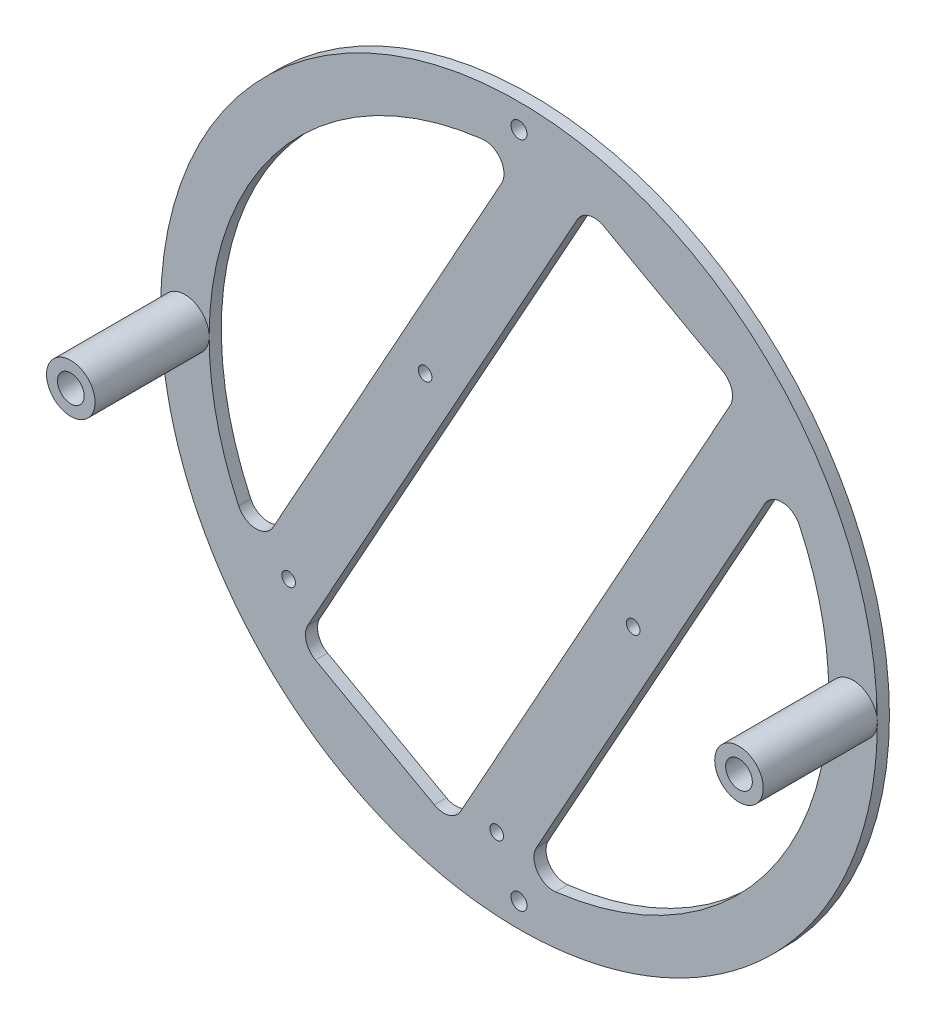
ISO-10303-21;
HEADER;
FILE_DESCRIPTION(('STEP AP214'),'2;1');
FILE_NAME('part.step','',(''),(''),'','','');
FILE_SCHEMA(('AUTOMOTIVE_DESIGN { 1 0 10303 214 1 1 1 1 }'));
ENDSEC;
DATA;
#1=APPLICATION_CONTEXT('core data for automotive mechanical design processes');
#2=APPLICATION_PROTOCOL_DEFINITION('international standard','automotive_design',2000,#1);
#3=PRODUCT_CONTEXT('',#1,'mechanical');
#4=PRODUCT('Part','Part','',(#3));
#5=PRODUCT_RELATED_PRODUCT_CATEGORY('part','',(#4));
#6=PRODUCT_DEFINITION_FORMATION('','',#4);
#7=PRODUCT_DEFINITION_CONTEXT('part definition',#1,'design');
#8=PRODUCT_DEFINITION('design','',#6,#7);
#9=PRODUCT_DEFINITION_SHAPE('','',#8);
#10=(LENGTH_UNIT() NAMED_UNIT(*) SI_UNIT(.MILLI.,.METRE.));
#11=(NAMED_UNIT(*) PLANE_ANGLE_UNIT() SI_UNIT($,.RADIAN.));
#12=(NAMED_UNIT(*) SI_UNIT($,.STERADIAN.) SOLID_ANGLE_UNIT());
#13=UNCERTAINTY_MEASURE_WITH_UNIT(LENGTH_MEASURE(1.E-05),#10,'distance_accuracy_value','');
#14=(GEOMETRIC_REPRESENTATION_CONTEXT(3) GLOBAL_UNCERTAINTY_ASSIGNED_CONTEXT((#13)) GLOBAL_UNIT_ASSIGNED_CONTEXT((#10,
#11,#12)) REPRESENTATION_CONTEXT('',''));
#15=CARTESIAN_POINT('',(0.,0.,0.));
#16=DIRECTION('',(0.,0.,1.));
#17=DIRECTION('',(1.,0.,0.));
#18=AXIS2_PLACEMENT_3D('',#15,#16,#17);
#19=CARTESIAN_POINT('',(0.,0.,2.5));
#20=DIRECTION('',(0.,0.,1.));
#21=DIRECTION('',(1.,0.,0.));
#22=AXIS2_PLACEMENT_3D('',#19,#20,#21);
#23=PLANE('',#22);
#24=CARTESIAN_POINT('',(68.825,0.,2.5));
#25=DIRECTION('',(0.,0.,1.));
#26=DIRECTION('',(1.,0.,0.));
#27=AXIS2_PLACEMENT_3D('',#24,#25,#26);
#28=CIRCLE('',#27,1.65);
#29=CARTESIAN_POINT('',(70.475,0.,2.5));
#30=VERTEX_POINT('',#29);
#31=EDGE_CURVE('E216',#30,#30,#28,.T.);
#32=ORIENTED_EDGE('',*,*,#31,.F.);
#33=EDGE_LOOP('',(#32));
#34=FACE_BOUND('',#33,.T.);
#35=CARTESIAN_POINT('',(68.825,0.,2.5));
#36=DIRECTION('',(0.,0.,1.));
#37=DIRECTION('',(1.,0.,0.));
#38=AXIS2_PLACEMENT_3D('',#35,#36,#37);
#39=CIRCLE('',#38,2.75000000000001);
#40=CARTESIAN_POINT('',(71.575,0.,2.5));
#41=VERTEX_POINT('',#40);
#42=EDGE_CURVE('E50',#41,#41,#39,.F.);
#43=ORIENTED_EDGE('',*,*,#42,.F.);
#44=EDGE_LOOP('',(#43));
#45=FACE_BOUND('',#44,.T.);
#46=ADVANCED_FACE('F42',(#34,#45),#23,.T.);
#47=CARTESIAN_POINT('',(-68.825,0.,2.5));
#48=DIRECTION('',(0.,0.,1.));
#49=DIRECTION('',(1.,0.,0.));
#50=AXIS2_PLACEMENT_3D('',#47,#48,#49);
#51=CIRCLE('',#50,1.65);
#52=CARTESIAN_POINT('',(-67.175,0.,2.5));
#53=VERTEX_POINT('',#52);
#54=EDGE_CURVE('E210',#53,#53,#51,.T.);
#55=ORIENTED_EDGE('',*,*,#54,.F.);
#56=EDGE_LOOP('',(#55));
#57=FACE_BOUND('',#56,.T.);
#58=CARTESIAN_POINT('',(-68.825,0.,2.5));
#59=DIRECTION('',(0.,0.,1.));
#60=DIRECTION('',(1.,0.,0.));
#61=AXIS2_PLACEMENT_3D('',#58,#59,#60);
#62=CIRCLE('',#61,2.75000000000001);
#63=CARTESIAN_POINT('',(-66.075,0.,2.5));
#64=VERTEX_POINT('',#63);
#65=EDGE_CURVE('E371',#64,#64,#62,.T.);
#66=ORIENTED_EDGE('',*,*,#65,.T.);
#67=EDGE_LOOP('',(#66));
#68=FACE_BOUND('',#67,.T.);
#69=ADVANCED_FACE('F398',(#57,#68),#23,.T.);
#70=CARTESIAN_POINT('',(-27.1132109213214,15.0290982276363,2.5));
#71=DIRECTION('',(0.874619707139399,-0.484809620246332,0.));
#72=DIRECTION('',(0.484809620246332,0.874619707139399,0.));
#73=AXIS2_PLACEMENT_3D('',#70,#71,#72);
#74=PLANE('',#73);
#75=DIRECTION('',(-0.484809620246332,-0.874619707139399,0.));
#76=VECTOR('',#75,1.);
#77=CARTESIAN_POINT('',(-27.1132109213214,15.0290982276363,0.));
#78=LINE('',#77,#76);
#79=CARTESIAN_POINT('',(-3.59104639275873,57.4642063445155,0.));
#80=VERTEX_POINT('',#79);
#81=CARTESIAN_POINT('',(-50.635375449884,-27.4060098892429,0.));
#82=VERTEX_POINT('',#81);
#83=EDGE_CURVE('E288',#80,#82,#78,.T.);
#84=ORIENTED_EDGE('',*,*,#83,.T.);
#85=DIRECTION('',(0.,0.,1.));
#86=VECTOR('',#85,1.);
#87=CARTESIAN_POINT('',(-50.635375449884,-27.4060098892429,2.5));
#88=LINE('',#87,#86);
#89=CARTESIAN_POINT('',(-50.635375449884,-27.4060098892429,2.5));
#90=VERTEX_POINT('',#89);
#91=EDGE_CURVE('E329',#82,#90,#88,.T.);
#92=ORIENTED_EDGE('',*,*,#91,.T.);
#93=DIRECTION('',(-0.484809620246332,-0.874619707139399,0.));
#94=VECTOR('',#93,1.);
#95=CARTESIAN_POINT('',(-27.1132109213214,15.0290982276363,2.5));
#96=LINE('',#95,#94);
#97=CARTESIAN_POINT('',(-3.59104639275873,57.4642063445155,2.5));
#98=VERTEX_POINT('',#97);
#99=EDGE_CURVE('E235',#98,#90,#96,.T.);
#100=ORIENTED_EDGE('',*,*,#99,.F.);
#101=DIRECTION('',(0.,0.,1.));
#102=VECTOR('',#101,1.);
#103=CARTESIAN_POINT('',(-3.59104639275873,57.4642063445155,0.));
#104=LINE('',#103,#102);
#105=EDGE_CURVE('E326',#98,#80,#104,.F.);
#106=ORIENTED_EDGE('',*,*,#105,.T.);
#107=EDGE_LOOP('',(#84,#92,#100,#106));
#108=FACE_BOUND('',#107,.T.);
#109=ADVANCED_FACE('F404',(#108),#74,.F.);
#110=CARTESIAN_POINT('',(-15.7431547285092,8.72657316443398,2.5));
#111=DIRECTION('',(-0.874619707139399,0.484809620246332,0.));
#112=DIRECTION('',(-0.484809620246332,-0.874619707139399,0.));
#113=AXIS2_PLACEMENT_3D('',#110,#111,#112);
#114=PLANE('',#113);
#115=DIRECTION('',(0.484809620246332,0.874619707139399,0.));
#116=VECTOR('',#115,1.);
#117=CARTESIAN_POINT('',(-15.7431547285092,8.72657316443398,2.5));
#118=LINE('',#117,#116);
#119=CARTESIAN_POINT('',(-43.4908588574801,-41.3316101833723,2.5));
#120=VERTEX_POINT('',#119);
#121=CARTESIAN_POINT('',(12.0045494004617,58.7847565122402,2.5));
#122=VERTEX_POINT('',#121);
#123=EDGE_CURVE('E222',#120,#122,#118,.T.);
#124=ORIENTED_EDGE('',*,*,#123,.F.);
#125=DIRECTION('',(0.,0.,-1.));
#126=VECTOR('',#125,1.);
#127=CARTESIAN_POINT('',(-43.4908588574801,-41.3316101833723,2.5));
#128=LINE('',#127,#126);
#129=CARTESIAN_POINT('',(-43.4908588574801,-41.3316101833723,0.));
#130=VERTEX_POINT('',#129);
#131=EDGE_CURVE('E304',#120,#130,#128,.T.);
#132=ORIENTED_EDGE('',*,*,#131,.T.);
#133=DIRECTION('',(0.484809620246332,0.874619707139399,0.));
#134=VECTOR('',#133,1.);
#135=CARTESIAN_POINT('',(-15.7431547285092,8.72657316443398,0.));
#136=LINE('',#135,#134);
#137=CARTESIAN_POINT('',(12.0045494004617,58.7847565122402,0.));
#138=VERTEX_POINT('',#137);
#139=EDGE_CURVE('E273',#130,#138,#136,.T.);
#140=ORIENTED_EDGE('',*,*,#139,.T.);
#141=DIRECTION('',(0.,0.,-1.));
#142=VECTOR('',#141,1.);
#143=CARTESIAN_POINT('',(12.0045494004617,58.7847565122402,2.5));
#144=LINE('',#143,#142);
#145=EDGE_CURVE('E302',#138,#122,#144,.F.);
#146=ORIENTED_EDGE('',*,*,#145,.T.);
#147=EDGE_LOOP('',(#124,#132,#140,#146));
#148=FACE_BOUND('',#147,.T.);
#149=ADVANCED_FACE('F432',(#148),#114,.F.);
#150=CARTESIAN_POINT('',(29.6869426099562,53.5566621763639,2.5));
#151=DIRECTION('',(0.484809620246331,0.874619707139399,0.));
#152=DIRECTION('',(-0.874619707139399,0.484809620246331,0.));
#153=AXIS2_PLACEMENT_3D('',#150,#151,#152);
#154=PLANE('',#153);
#155=DIRECTION('',(0.874619707139399,-0.484809620246331,0.));
#156=VECTOR('',#155,1.);
#157=CARTESIAN_POINT('',(29.6869426099562,53.5566621763639,0.));
#158=LINE('',#157,#156);
#159=CARTESIAN_POINT('',(17.4422667100046,60.3439968598125,0.));
#160=VERTEX_POINT('',#159);
#161=CARTESIAN_POINT('',(41.9316185099078,46.7693274929152,0.));
#162=VERTEX_POINT('',#161);
#163=EDGE_CURVE('E276',#160,#162,#158,.T.);
#164=ORIENTED_EDGE('',*,*,#163,.T.);
#165=DIRECTION('',(0.,0.,-1.));
#166=VECTOR('',#165,1.);
#167=CARTESIAN_POINT('',(41.9316185099078,46.7693274929152,2.5));
#168=LINE('',#167,#166);
#169=CARTESIAN_POINT('',(41.9316185099078,46.7693274929152,2.5));
#170=VERTEX_POINT('',#169);
#171=EDGE_CURVE('E310',#162,#170,#168,.F.);
#172=ORIENTED_EDGE('',*,*,#171,.T.);
#173=DIRECTION('',(0.874619707139399,-0.484809620246331,0.));
#174=VECTOR('',#173,1.);
#175=CARTESIAN_POINT('',(29.6869426099562,53.5566621763639,2.5));
#176=LINE('',#175,#174);
#177=CARTESIAN_POINT('',(17.4422667100046,60.3439968598125,2.5));
#178=VERTEX_POINT('',#177);
#179=EDGE_CURVE('E225',#178,#170,#176,.T.);
#180=ORIENTED_EDGE('',*,*,#179,.F.);
#181=DIRECTION('',(0.,0.,-1.));
#182=VECTOR('',#181,1.);
#183=CARTESIAN_POINT('',(17.4422667100046,60.3439968598125,0.));
#184=LINE('',#183,#182);
#185=EDGE_CURVE('E307',#178,#160,#184,.T.);
#186=ORIENTED_EDGE('',*,*,#185,.T.);
#187=EDGE_LOOP('',(#164,#172,#180,#186));
#188=FACE_BOUND('',#187,.T.);
#189=ADVANCED_FACE('F446',(#188),#154,.F.);
#190=CARTESIAN_POINT('',(15.7431547285092,-8.72657316443397,2.5));
#191=DIRECTION('',(0.874619707139399,-0.484809620246332,0.));
#192=DIRECTION('',(0.484809620246332,0.874619707139399,0.));
#193=AXIS2_PLACEMENT_3D('',#190,#191,#192);
#194=PLANE('',#193);
#195=DIRECTION('',(-0.484809620246332,-0.874619707139399,0.));
#196=VECTOR('',#195,1.);
#197=CARTESIAN_POINT('',(15.7431547285092,-8.72657316443397,0.));
#198=LINE('',#197,#196);
#199=CARTESIAN_POINT('',(43.4908588574801,41.3316101833723,0.));
#200=VERTEX_POINT('',#199);
#201=CARTESIAN_POINT('',(-12.0045494004617,-58.7847565122403,0.));
#202=VERTEX_POINT('',#201);
#203=EDGE_CURVE('E279',#200,#202,#198,.T.);
#204=ORIENTED_EDGE('',*,*,#203,.T.);
#205=DIRECTION('',(0.,0.,-1.));
#206=VECTOR('',#205,1.);
#207=CARTESIAN_POINT('',(-12.0045494004617,-58.7847565122403,2.5));
#208=LINE('',#207,#206);
#209=CARTESIAN_POINT('',(-12.0045494004617,-58.7847565122403,2.5));
#210=VERTEX_POINT('',#209);
#211=EDGE_CURVE('E300',#202,#210,#208,.F.);
#212=ORIENTED_EDGE('',*,*,#211,.T.);
#213=DIRECTION('',(-0.484809620246332,-0.874619707139399,0.));
#214=VECTOR('',#213,1.);
#215=CARTESIAN_POINT('',(15.7431547285092,-8.72657316443397,2.5));
#216=LINE('',#215,#214);
#217=CARTESIAN_POINT('',(43.4908588574801,41.3316101833723,2.5));
#218=VERTEX_POINT('',#217);
#219=EDGE_CURVE('E228',#218,#210,#216,.T.);
#220=ORIENTED_EDGE('',*,*,#219,.F.);
#221=DIRECTION('',(0.,0.,-1.));
#222=VECTOR('',#221,1.);
#223=CARTESIAN_POINT('',(43.4908588574801,41.3316101833723,0.));
#224=LINE('',#223,#222);
#225=EDGE_CURVE('E297',#218,#200,#224,.T.);
#226=ORIENTED_EDGE('',*,*,#225,.T.);
#227=EDGE_LOOP('',(#204,#212,#220,#226));
#228=FACE_BOUND('',#227,.T.);
#229=ADVANCED_FACE('F443',(#228),#194,.F.);
#230=CARTESIAN_POINT('',(0.,0.,2.5));
#231=DIRECTION('',(0.,0.,-1.));
#232=DIRECTION('',(-1.,0.,0.));
#233=AXIS2_PLACEMENT_3D('',#230,#231,#232);
#234=CYLINDRICAL_SURFACE('',#233,63.825);
#235=CARTESIAN_POINT('',(0.,0.,0.));
#236=DIRECTION('',(0.,0.,1.));
#237=DIRECTION('',(1.,0.,0.));
#238=AXIS2_PLACEMENT_3D('',#235,#236,#237);
#239=CIRCLE('',#238,63.825);
#240=CARTESIAN_POINT('',(7.56354278730486,-63.3752589383634,0.));
#241=VERTEX_POINT('',#240);
#242=CARTESIAN_POINT('',(57.7533347149442,27.1695225262355,0.));
#243=VERTEX_POINT('',#242);
#244=EDGE_CURVE('E242',#241,#243,#239,.T.);
#245=ORIENTED_EDGE('',*,*,#244,.F.);
#246=DIRECTION('',(0.,0.,-1.));
#247=VECTOR('',#246,1.);
#248=CARTESIAN_POINT('',(7.56354278730486,-63.3752589383634,2.5));
#249=LINE('',#248,#247);
#250=CARTESIAN_POINT('',(7.56354278730486,-63.3752589383634,2.5));
#251=VERTEX_POINT('',#250);
#252=EDGE_CURVE('E191',#241,#251,#249,.F.);
#253=ORIENTED_EDGE('',*,*,#252,.T.);
#254=CARTESIAN_POINT('',(0.,0.,2.5));
#255=DIRECTION('',(0.,0.,1.));
#256=DIRECTION('',(1.,0.,0.));
#257=AXIS2_PLACEMENT_3D('',#254,#255,#256);
#258=CIRCLE('',#257,63.825);
#259=CARTESIAN_POINT('',(63.825,0.,2.5));
#260=VERTEX_POINT('',#259);
#261=EDGE_CURVE('E174',#251,#260,#258,.T.);
#262=ORIENTED_EDGE('',*,*,#261,.T.);
#263=CARTESIAN_POINT('',(57.7533347149442,27.1695225262355,2.5));
#264=VERTEX_POINT('',#263);
#265=EDGE_CURVE('E179',#260,#264,#258,.T.);
#266=ORIENTED_EDGE('',*,*,#265,.T.);
#267=DIRECTION('',(0.,0.,-1.));
#268=VECTOR('',#267,1.);
#269=CARTESIAN_POINT('',(57.7533347149442,27.1695225262356,2.5));
#270=LINE('',#269,#268);
#271=EDGE_CURVE('E317',#264,#243,#270,.T.);
#272=ORIENTED_EDGE('',*,*,#271,.T.);
#273=EDGE_LOOP('',(#245,#253,#262,#266,#272));
#274=FACE_BOUND('',#273,.T.);
#275=ADVANCED_FACE('F189',(#274),#234,.F.);
#276=CARTESIAN_POINT('',(0.,0.,2.5));
#277=DIRECTION('',(0.,0.,-1.));
#278=DIRECTION('',(-1.,0.,0.));
#279=AXIS2_PLACEMENT_3D('',#276,#277,#278);
#280=CYLINDRICAL_SURFACE('',#279,73.825);
#281=CARTESIAN_POINT('',(0.,0.,2.5));
#282=DIRECTION('',(0.,0.,1.));
#283=DIRECTION('',(1.,0.,0.));
#284=AXIS2_PLACEMENT_3D('',#281,#282,#283);
#285=CIRCLE('',#284,73.825);
#286=CARTESIAN_POINT('',(-73.825,0.,2.5));
#287=VERTEX_POINT('',#286);
#288=CARTESIAN_POINT('',(73.825,0.,2.5));
#289=VERTEX_POINT('',#288);
#290=EDGE_CURVE('E177',#287,#289,#285,.T.);
#291=ORIENTED_EDGE('',*,*,#290,.F.);
#292=EDGE_CURVE('E61',#289,#287,#285,.T.);
#293=ORIENTED_EDGE('',*,*,#292,.F.);
#294=EDGE_LOOP('',(#291,#293));
#295=FACE_BOUND('',#294,.T.);
#296=CARTESIAN_POINT('',(0.,0.,0.));
#297=DIRECTION('',(0.,0.,1.));
#298=DIRECTION('',(1.,0.,0.));
#299=AXIS2_PLACEMENT_3D('',#296,#297,#298);
#300=CIRCLE('',#299,73.825);
#301=CARTESIAN_POINT('',(73.825,0.,0.));
#302=VERTEX_POINT('',#301);
#303=EDGE_CURVE('E285',#302,#302,#300,.T.);
#304=ORIENTED_EDGE('',*,*,#303,.T.);
#305=EDGE_LOOP('',(#304));
#306=FACE_BOUND('',#305,.T.);
#307=ADVANCED_FACE('F434',(#295,#306),#280,.T.);
#308=CARTESIAN_POINT('',(-29.6869426099563,-53.5566621763639,2.5));
#309=DIRECTION('',(0.484809620246332,0.874619707139398,0.));
#310=DIRECTION('',(-0.874619707139399,0.484809620246332,0.));
#311=AXIS2_PLACEMENT_3D('',#308,#309,#310);
#312=PLANE('',#311);
#313=DIRECTION('',(0.874619707139399,-0.484809620246332,0.));
#314=VECTOR('',#313,1.);
#315=CARTESIAN_POINT('',(-29.6869426099563,-53.5566621763639,2.5));
#316=LINE('',#315,#314);
#317=CARTESIAN_POINT('',(-41.9316185099078,-46.7693274929152,2.5));
#318=VERTEX_POINT('',#317);
#319=CARTESIAN_POINT('',(-17.4422667100046,-60.3439968598125,2.5));
#320=VERTEX_POINT('',#319);
#321=EDGE_CURVE('E231',#318,#320,#316,.T.);
#322=ORIENTED_EDGE('',*,*,#321,.T.);
#323=DIRECTION('',(0.,0.,-1.));
#324=VECTOR('',#323,1.);
#325=CARTESIAN_POINT('',(-17.4422667100046,-60.3439968598125,2.5));
#326=LINE('',#325,#324);
#327=CARTESIAN_POINT('',(-17.4422667100046,-60.3439968598125,0.));
#328=VERTEX_POINT('',#327);
#329=EDGE_CURVE('E294',#320,#328,#326,.T.);
#330=ORIENTED_EDGE('',*,*,#329,.T.);
#331=DIRECTION('',(0.874619707139399,-0.484809620246332,0.));
#332=VECTOR('',#331,1.);
#333=CARTESIAN_POINT('',(-29.6869426099563,-53.5566621763639,0.));
#334=LINE('',#333,#332);
#335=CARTESIAN_POINT('',(-41.9316185099078,-46.7693274929152,0.));
#336=VERTEX_POINT('',#335);
#337=EDGE_CURVE('E282',#336,#328,#334,.T.);
#338=ORIENTED_EDGE('',*,*,#337,.F.);
#339=DIRECTION('',(0.,0.,-1.));
#340=VECTOR('',#339,1.);
#341=CARTESIAN_POINT('',(-41.9316185099078,-46.7693274929152,2.5));
#342=LINE('',#341,#340);
#343=EDGE_CURVE('E241',#336,#318,#342,.F.);
#344=ORIENTED_EDGE('',*,*,#343,.T.);
#345=EDGE_LOOP('',(#322,#330,#338,#344));
#346=FACE_BOUND('',#345,.T.);
#347=ADVANCED_FACE('F437',(#346),#312,.T.);
#348=CARTESIAN_POINT('',(0.,68.825,2.5));
#349=DIRECTION('',(0.,0.,-1.));
#350=DIRECTION('',(-1.,0.,0.));
#351=AXIS2_PLACEMENT_3D('',#348,#349,#350);
#352=CYLINDRICAL_SURFACE('',#351,1.65);
#353=CARTESIAN_POINT('',(0.,68.825,2.5));
#354=DIRECTION('',(0.,0.,1.));
#355=DIRECTION('',(1.,0.,0.));
#356=AXIS2_PLACEMENT_3D('',#353,#354,#355);
#357=CIRCLE('',#356,1.65);
#358=CARTESIAN_POINT('',(1.65,68.825,2.5));
#359=VERTEX_POINT('',#358);
#360=EDGE_CURVE('E219',#359,#359,#357,.T.);
#361=ORIENTED_EDGE('',*,*,#360,.T.);
#362=EDGE_LOOP('',(#361));
#363=FACE_BOUND('',#362,.T.);
#364=CARTESIAN_POINT('',(0.,68.825,0.));
#365=DIRECTION('',(0.,0.,1.));
#366=DIRECTION('',(1.,0.,0.));
#367=AXIS2_PLACEMENT_3D('',#364,#365,#366);
#368=CIRCLE('',#367,1.65);
#369=CARTESIAN_POINT('',(1.65,68.825,0.));
#370=VERTEX_POINT('',#369);
#371=EDGE_CURVE('E270',#370,#370,#368,.T.);
#372=ORIENTED_EDGE('',*,*,#371,.F.);
#373=EDGE_LOOP('',(#372));
#374=FACE_BOUND('',#373,.T.);
#375=ADVANCED_FACE('F441',(#363,#374),#352,.F.);
#376=CARTESIAN_POINT('',(68.825,0.,2.5));
#377=DIRECTION('',(0.,0.,-1.));
#378=DIRECTION('',(-1.,0.,0.));
#379=AXIS2_PLACEMENT_3D('',#376,#377,#378);
#380=CYLINDRICAL_SURFACE('',#379,1.65);
#381=ORIENTED_EDGE('',*,*,#31,.T.);
#382=EDGE_LOOP('',(#381));
#383=FACE_BOUND('',#382,.T.);
#384=CARTESIAN_POINT('',(68.825,0.,0.));
#385=DIRECTION('',(0.,0.,1.));
#386=DIRECTION('',(1.,0.,0.));
#387=AXIS2_PLACEMENT_3D('',#384,#385,#386);
#388=CIRCLE('',#387,1.65);
#389=CARTESIAN_POINT('',(70.475,0.,0.));
#390=VERTEX_POINT('',#389);
#391=EDGE_CURVE('E267',#390,#390,#388,.T.);
#392=ORIENTED_EDGE('',*,*,#391,.F.);
#393=EDGE_LOOP('',(#392));
#394=FACE_BOUND('',#393,.T.);
#395=ADVANCED_FACE('F456',(#383,#394),#380,.F.);
#396=CARTESIAN_POINT('',(0.,-68.825,2.5));
#397=DIRECTION('',(0.,0.,-1.));
#398=DIRECTION('',(-1.,0.,0.));
#399=AXIS2_PLACEMENT_3D('',#396,#397,#398);
#400=CYLINDRICAL_SURFACE('',#399,1.65);
#401=CARTESIAN_POINT('',(0.,-68.825,2.5));
#402=DIRECTION('',(0.,0.,1.));
#403=DIRECTION('',(1.,0.,0.));
#404=AXIS2_PLACEMENT_3D('',#401,#402,#403);
#405=CIRCLE('',#404,1.65);
#406=CARTESIAN_POINT('',(1.65000000000001,-68.825,2.5));
#407=VERTEX_POINT('',#406);
#408=EDGE_CURVE('E213',#407,#407,#405,.T.);
#409=ORIENTED_EDGE('',*,*,#408,.T.);
#410=EDGE_LOOP('',(#409));
#411=FACE_BOUND('',#410,.T.);
#412=CARTESIAN_POINT('',(0.,-68.825,0.));
#413=DIRECTION('',(0.,0.,1.));
#414=DIRECTION('',(1.,0.,0.));
#415=AXIS2_PLACEMENT_3D('',#412,#413,#414);
#416=CIRCLE('',#415,1.65);
#417=CARTESIAN_POINT('',(1.65000000000001,-68.825,0.));
#418=VERTEX_POINT('',#417);
#419=EDGE_CURVE('E264',#418,#418,#416,.T.);
#420=ORIENTED_EDGE('',*,*,#419,.F.);
#421=EDGE_LOOP('',(#420));
#422=FACE_BOUND('',#421,.T.);
#423=ADVANCED_FACE('F460',(#411,#422),#400,.F.);
#424=CARTESIAN_POINT('',(-68.825,0.,2.5));
#425=DIRECTION('',(0.,0.,-1.));
#426=DIRECTION('',(-1.,0.,0.));
#427=AXIS2_PLACEMENT_3D('',#424,#425,#426);
#428=CYLINDRICAL_SURFACE('',#427,1.65);
#429=ORIENTED_EDGE('',*,*,#54,.T.);
#430=EDGE_LOOP('',(#429));
#431=FACE_BOUND('',#430,.T.);
#432=CARTESIAN_POINT('',(-68.825,0.,0.));
#433=DIRECTION('',(0.,0.,1.));
#434=DIRECTION('',(1.,0.,0.));
#435=AXIS2_PLACEMENT_3D('',#432,#433,#434);
#436=CIRCLE('',#435,1.65);
#437=CARTESIAN_POINT('',(-67.175,0.,0.));
#438=VERTEX_POINT('',#437);
#439=EDGE_CURVE('E261',#438,#438,#436,.T.);
#440=ORIENTED_EDGE('',*,*,#439,.F.);
#441=EDGE_LOOP('',(#440));
#442=FACE_BOUND('',#441,.T.);
#443=ADVANCED_FACE('F464',(#431,#442),#428,.F.);
#444=CARTESIAN_POINT('',(-4.59503681806762,-58.8249666778943,2.5));
#445=DIRECTION('',(0.,0.,-1.));
#446=DIRECTION('',(-1.,0.,0.));
#447=AXIS2_PLACEMENT_3D('',#444,#445,#446);
#448=CYLINDRICAL_SURFACE('',#447,1.40000000000004);
#449=CARTESIAN_POINT('',(-4.59503681806762,-58.8249666778943,2.5));
#450=DIRECTION('',(0.,0.,1.));
#451=DIRECTION('',(1.,0.,0.));
#452=AXIS2_PLACEMENT_3D('',#449,#450,#451);
#453=CIRCLE('',#452,1.40000000000004);
#454=CARTESIAN_POINT('',(-3.19503681806758,-58.8249666778943,2.5));
#455=VERTEX_POINT('',#454);
#456=EDGE_CURVE('E207',#455,#455,#453,.T.);
#457=ORIENTED_EDGE('',*,*,#456,.T.);
#458=EDGE_LOOP('',(#457));
#459=FACE_BOUND('',#458,.T.);
#460=CARTESIAN_POINT('',(-4.59503681806762,-58.8249666778943,0.));
#461=DIRECTION('',(0.,0.,1.));
#462=DIRECTION('',(1.,0.,0.));
#463=AXIS2_PLACEMENT_3D('',#460,#461,#462);
#464=CIRCLE('',#463,1.40000000000004);
#465=CARTESIAN_POINT('',(-3.19503681806758,-58.8249666778943,0.));
#466=VERTEX_POINT('',#465);
#467=EDGE_CURVE('E258',#466,#466,#464,.T.);
#468=ORIENTED_EDGE('',*,*,#467,.F.);
#469=EDGE_LOOP('',(#468));
#470=FACE_BOUND('',#469,.T.);
#471=ADVANCED_FACE('F468',(#459,#470),#448,.F.);
#472=CARTESIAN_POINT('',(-47.4514024678982,-35.0692952858241,2.5));
#473=DIRECTION('',(0.,0.,-1.));
#474=DIRECTION('',(-1.,0.,0.));
#475=AXIS2_PLACEMENT_3D('',#472,#473,#474);
#476=CYLINDRICAL_SURFACE('',#475,1.40000000000003);
#477=CARTESIAN_POINT('',(-47.4514024678982,-35.0692952858241,2.5));
#478=DIRECTION('',(0.,0.,1.));
#479=DIRECTION('',(1.,0.,0.));
#480=AXIS2_PLACEMENT_3D('',#477,#478,#479);
#481=CIRCLE('',#480,1.40000000000003);
#482=CARTESIAN_POINT('',(-46.0514024678981,-35.0692952858241,2.5));
#483=VERTEX_POINT('',#482);
#484=EDGE_CURVE('E204',#483,#483,#481,.T.);
#485=ORIENTED_EDGE('',*,*,#484,.T.);
#486=EDGE_LOOP('',(#485));
#487=FACE_BOUND('',#486,.T.);
#488=CARTESIAN_POINT('',(-47.4514024678982,-35.0692952858241,0.));
#489=DIRECTION('',(0.,0.,1.));
#490=DIRECTION('',(1.,0.,0.));
#491=AXIS2_PLACEMENT_3D('',#488,#489,#490);
#492=CIRCLE('',#491,1.40000000000003);
#493=CARTESIAN_POINT('',(-46.0514024678981,-35.0692952858241,0.));
#494=VERTEX_POINT('',#493);
#495=EDGE_CURVE('E255',#494,#494,#492,.T.);
#496=ORIENTED_EDGE('',*,*,#495,.F.);
#497=EDGE_LOOP('',(#496));
#498=FACE_BOUND('',#497,.T.);
#499=ADVANCED_FACE('F472',(#487,#498),#476,.F.);
#500=CARTESIAN_POINT('',(-19.332444493611,15.6586477282611,2.5));
#501=DIRECTION('',(0.,0.,-1.));
#502=DIRECTION('',(-1.,0.,0.));
#503=AXIS2_PLACEMENT_3D('',#500,#501,#502);
#504=CYLINDRICAL_SURFACE('',#503,1.40000000000002);
#505=CARTESIAN_POINT('',(-19.332444493611,15.6586477282611,2.5));
#506=DIRECTION('',(0.,0.,1.));
#507=DIRECTION('',(1.,0.,0.));
#508=AXIS2_PLACEMENT_3D('',#505,#506,#507);
#509=CIRCLE('',#508,1.40000000000002);
#510=CARTESIAN_POINT('',(-17.9324444936109,15.6586477282611,2.5));
#511=VERTEX_POINT('',#510);
#512=EDGE_CURVE('E201',#511,#511,#509,.T.);
#513=ORIENTED_EDGE('',*,*,#512,.T.);
#514=EDGE_LOOP('',(#513));
#515=FACE_BOUND('',#514,.T.);
#516=CARTESIAN_POINT('',(-19.332444493611,15.6586477282611,0.));
#517=DIRECTION('',(0.,0.,1.));
#518=DIRECTION('',(1.,0.,0.));
#519=AXIS2_PLACEMENT_3D('',#516,#517,#518);
#520=CIRCLE('',#519,1.40000000000002);
#521=CARTESIAN_POINT('',(-17.9324444936109,15.6586477282611,0.));
#522=VERTEX_POINT('',#521);
#523=EDGE_CURVE('E252',#522,#522,#520,.T.);
#524=ORIENTED_EDGE('',*,*,#523,.F.);
#525=EDGE_LOOP('',(#524));
#526=FACE_BOUND('',#525,.T.);
#527=ADVANCED_FACE('F476',(#515,#526),#504,.F.);
#528=CARTESIAN_POINT('',(23.5239211562196,-8.09702366380917,2.5));
#529=DIRECTION('',(0.,0.,-1.));
#530=DIRECTION('',(-1.,0.,0.));
#531=AXIS2_PLACEMENT_3D('',#528,#529,#530);
#532=CYLINDRICAL_SURFACE('',#531,1.40000000000003);
#533=CARTESIAN_POINT('',(23.5239211562196,-8.09702366380917,2.5));
#534=DIRECTION('',(0.,0.,1.));
#535=DIRECTION('',(1.,0.,0.));
#536=AXIS2_PLACEMENT_3D('',#533,#534,#535);
#537=CIRCLE('',#536,1.40000000000003);
#538=CARTESIAN_POINT('',(24.9239211562196,-8.09702366380917,2.5));
#539=VERTEX_POINT('',#538);
#540=EDGE_CURVE('E193',#539,#539,#537,.T.);
#541=ORIENTED_EDGE('',*,*,#540,.T.);
#542=EDGE_LOOP('',(#541));
#543=FACE_BOUND('',#542,.T.);
#544=CARTESIAN_POINT('',(23.5239211562196,-8.09702366380917,0.));
#545=DIRECTION('',(0.,0.,1.));
#546=DIRECTION('',(1.,0.,0.));
#547=AXIS2_PLACEMENT_3D('',#544,#545,#546);
#548=CIRCLE('',#547,1.40000000000003);
#549=CARTESIAN_POINT('',(24.9239211562196,-8.09702366380917,0.));
#550=VERTEX_POINT('',#549);
#551=EDGE_CURVE('E249',#550,#550,#548,.T.);
#552=ORIENTED_EDGE('',*,*,#551,.F.);
#553=EDGE_LOOP('',(#552));
#554=FACE_BOUND('',#553,.T.);
#555=ADVANCED_FACE('F425',(#543,#554),#532,.F.);
#556=CARTESIAN_POINT('',(27.1132109213214,-15.0290982276363,2.5));
#557=DIRECTION('',(-0.874619707139399,0.484809620246332,0.));
#558=DIRECTION('',(-0.484809620246332,-0.874619707139399,0.));
#559=AXIS2_PLACEMENT_3D('',#556,#557,#558);
#560=PLANE('',#559);
#561=DIRECTION('',(0.484809620246332,0.874619707139399,0.));
#562=VECTOR('',#561,1.);
#563=CARTESIAN_POINT('',(27.1132109213214,-15.0290982276363,2.5));
#564=LINE('',#563,#562);
#565=CARTESIAN_POINT('',(3.5910463927587,-57.4642063445155,2.5));
#566=VERTEX_POINT('',#565);
#567=CARTESIAN_POINT('',(50.635375449884,27.406009889243,2.5));
#568=VERTEX_POINT('',#567);
#569=EDGE_CURVE('E192',#566,#568,#564,.T.);
#570=ORIENTED_EDGE('',*,*,#569,.F.);
#571=DIRECTION('',(0.,0.,-1.));
#572=VECTOR('',#571,1.);
#573=CARTESIAN_POINT('',(3.59104639275871,-57.4642063445155,2.5));
#574=LINE('',#573,#572);
#575=CARTESIAN_POINT('',(3.5910463927587,-57.4642063445155,0.));
#576=VERTEX_POINT('',#575);
#577=EDGE_CURVE('E314',#566,#576,#574,.T.);
#578=ORIENTED_EDGE('',*,*,#577,.T.);
#579=DIRECTION('',(0.484809620246332,0.874619707139399,0.));
#580=VECTOR('',#579,1.);
#581=CARTESIAN_POINT('',(27.1132109213214,-15.0290982276363,0.));
#582=LINE('',#581,#580);
#583=CARTESIAN_POINT('',(50.635375449884,27.406009889243,0.));
#584=VERTEX_POINT('',#583);
#585=EDGE_CURVE('E245',#576,#584,#582,.T.);
#586=ORIENTED_EDGE('',*,*,#585,.T.);
#587=DIRECTION('',(0.,0.,-1.));
#588=VECTOR('',#587,1.);
#589=CARTESIAN_POINT('',(50.635375449884,27.4060098892429,2.5));
#590=LINE('',#589,#588);
#591=EDGE_CURVE('E312',#584,#568,#590,.F.);
#592=ORIENTED_EDGE('',*,*,#591,.T.);
#593=EDGE_LOOP('',(#570,#578,#586,#592));
#594=FACE_BOUND('',#593,.T.);
#595=ADVANCED_FACE('F419',(#594),#560,.F.);
#596=CARTESIAN_POINT('',(0.,0.,2.5));
#597=DIRECTION('',(0.,0.,-1.));
#598=DIRECTION('',(-1.,0.,0.));
#599=AXIS2_PLACEMENT_3D('',#596,#597,#598);
#600=CYLINDRICAL_SURFACE('',#599,63.825);
#601=CARTESIAN_POINT('',(0.,0.,2.5));
#602=DIRECTION('',(0.,0.,1.));
#603=DIRECTION('',(1.,0.,0.));
#604=AXIS2_PLACEMENT_3D('',#601,#602,#603);
#605=CIRCLE('',#604,63.825);
#606=CARTESIAN_POINT('',(-57.7533347149442,-27.1695225262355,2.5));
#607=VERTEX_POINT('',#606);
#608=CARTESIAN_POINT('',(-63.825,0.,2.5));
#609=VERTEX_POINT('',#608);
#610=EDGE_CURVE('E239',#607,#609,#605,.F.);
#611=ORIENTED_EDGE('',*,*,#610,.F.);
#612=DIRECTION('',(0.,0.,-1.));
#613=VECTOR('',#612,1.);
#614=CARTESIAN_POINT('',(-57.7533347149442,-27.1695225262355,2.5));
#615=LINE('',#614,#613);
#616=CARTESIAN_POINT('',(-57.7533347149442,-27.1695225262355,0.));
#617=VERTEX_POINT('',#616);
#618=EDGE_CURVE('E323',#607,#617,#615,.T.);
#619=ORIENTED_EDGE('',*,*,#618,.T.);
#620=CARTESIAN_POINT('',(0.,0.,0.));
#621=DIRECTION('',(0.,0.,1.));
#622=DIRECTION('',(1.,0.,0.));
#623=AXIS2_PLACEMENT_3D('',#620,#621,#622);
#624=CIRCLE('',#623,63.825);
#625=CARTESIAN_POINT('',(-7.56354278730488,63.3752589383634,0.));
#626=VERTEX_POINT('',#625);
#627=EDGE_CURVE('E186',#617,#626,#624,.F.);
#628=ORIENTED_EDGE('',*,*,#627,.T.);
#629=DIRECTION('',(0.,0.,-1.));
#630=VECTOR('',#629,1.);
#631=CARTESIAN_POINT('',(-7.56354278730488,63.3752589383634,2.5));
#632=LINE('',#631,#630);
#633=CARTESIAN_POINT('',(-7.56354278730488,63.3752589383634,2.5));
#634=VERTEX_POINT('',#633);
#635=EDGE_CURVE('E320',#626,#634,#632,.F.);
#636=ORIENTED_EDGE('',*,*,#635,.T.);
#637=EDGE_CURVE('E238',#609,#634,#605,.F.);
#638=ORIENTED_EDGE('',*,*,#637,.F.);
#639=EDGE_LOOP('',(#611,#619,#628,#636,#638));
#640=FACE_BOUND('',#639,.T.);
#641=ADVANCED_FACE('F412',(#640),#600,.F.);
#642=ORIENTED_EDGE('',*,*,#290,.T.);
#643=CARTESIAN_POINT('',(68.825,0.,2.5));
#644=DIRECTION('',(0.,0.,1.));
#645=DIRECTION('',(1.,0.,0.));
#646=AXIS2_PLACEMENT_3D('',#643,#644,#645);
#647=CIRCLE('',#646,5.);
#648=EDGE_CURVE('E11',#289,#260,#647,.F.);
#649=ORIENTED_EDGE('',*,*,#648,.T.);
#650=ORIENTED_EDGE('',*,*,#261,.F.);
#651=CARTESIAN_POINT('',(7.08952522131631,-59.4034448255008,2.5));
#652=DIRECTION('',(0.,0.,1.));
#653=DIRECTION('',(1.,0.,0.));
#654=AXIS2_PLACEMENT_3D('',#651,#652,#653);
#655=CIRCLE('',#654,4.);
#656=EDGE_CURVE('E349',#251,#566,#655,.F.);
#657=ORIENTED_EDGE('',*,*,#656,.T.);
#658=ORIENTED_EDGE('',*,*,#569,.T.);
#659=CARTESIAN_POINT('',(54.1338542784416,25.4667714082576,2.5));
#660=DIRECTION('',(0.,0.,1.));
#661=DIRECTION('',(1.,0.,0.));
#662=AXIS2_PLACEMENT_3D('',#659,#660,#661);
#663=CIRCLE('',#662,4.);
#664=EDGE_CURVE('E182',#568,#264,#663,.F.);
#665=ORIENTED_EDGE('',*,*,#664,.T.);
#666=ORIENTED_EDGE('',*,*,#265,.F.);
#667=CARTESIAN_POINT('',(68.825,0.,2.5));
#668=DIRECTION('',(0.,0.,1.));
#669=DIRECTION('',(1.,0.,0.));
#670=AXIS2_PLACEMENT_3D('',#667,#668,#669);
#671=CIRCLE('',#670,5.);
#672=EDGE_CURVE('E163',#289,#260,#671,.T.);
#673=ORIENTED_EDGE('',*,*,#672,.F.);
#674=ORIENTED_EDGE('',*,*,#292,.T.);
#675=CARTESIAN_POINT('',(-68.825,0.,2.5));
#676=DIRECTION('',(0.,0.,1.));
#677=DIRECTION('',(1.,0.,0.));
#678=AXIS2_PLACEMENT_3D('',#675,#676,#677);
#679=CIRCLE('',#678,5.);
#680=EDGE_CURVE('E196',#609,#287,#679,.T.);
#681=ORIENTED_EDGE('',*,*,#680,.F.);
#682=ORIENTED_EDGE('',*,*,#637,.T.);
#683=CARTESIAN_POINT('',(-7.08952522131633,59.4034448255008,2.5));
#684=DIRECTION('',(0.,0.,1.));
#685=DIRECTION('',(1.,0.,0.));
#686=AXIS2_PLACEMENT_3D('',#683,#684,#685);
#687=CIRCLE('',#686,4.);
#688=EDGE_CURVE('E360',#634,#98,#687,.F.);
#689=ORIENTED_EDGE('',*,*,#688,.T.);
#690=ORIENTED_EDGE('',*,*,#99,.T.);
#691=CARTESIAN_POINT('',(-54.1338542784416,-25.4667714082576,2.5));
#692=DIRECTION('',(0.,0.,1.));
#693=DIRECTION('',(1.,0.,0.));
#694=AXIS2_PLACEMENT_3D('',#691,#692,#693);
#695=CIRCLE('',#694,4.);
#696=EDGE_CURVE('E356',#90,#607,#695,.F.);
#697=ORIENTED_EDGE('',*,*,#696,.T.);
#698=ORIENTED_EDGE('',*,*,#610,.T.);
#699=EDGE_CURVE('E361',#287,#609,#679,.T.);
#700=ORIENTED_EDGE('',*,*,#699,.F.);
#701=EDGE_LOOP('',(#642,#649,#650,#657,#658,#665,#666,#673,#674,#681,#682,#689,#690,#697,#698,#700));
#702=FACE_BOUND('',#701,.T.);
#703=ORIENTED_EDGE('',*,*,#540,.F.);
#704=EDGE_LOOP('',(#703));
#705=FACE_BOUND('',#704,.T.);
#706=ORIENTED_EDGE('',*,*,#512,.F.);
#707=EDGE_LOOP('',(#706));
#708=FACE_BOUND('',#707,.T.);
#709=ORIENTED_EDGE('',*,*,#484,.F.);
#710=EDGE_LOOP('',(#709));
#711=FACE_BOUND('',#710,.T.);
#712=ORIENTED_EDGE('',*,*,#456,.F.);
#713=EDGE_LOOP('',(#712));
#714=FACE_BOUND('',#713,.T.);
#715=ORIENTED_EDGE('',*,*,#408,.F.);
#716=EDGE_LOOP('',(#715));
#717=FACE_BOUND('',#716,.T.);
#718=ORIENTED_EDGE('',*,*,#360,.F.);
#719=EDGE_LOOP('',(#718));
#720=FACE_BOUND('',#719,.T.);
#721=ORIENTED_EDGE('',*,*,#321,.F.);
#722=CARTESIAN_POINT('',(-39.9923800289225,-43.2708486643576,2.5));
#723=DIRECTION('',(0.,0.,1.));
#724=DIRECTION('',(1.,0.,0.));
#725=AXIS2_PLACEMENT_3D('',#722,#723,#724);
#726=CIRCLE('',#725,4.);
#727=EDGE_CURVE('E337',#318,#120,#726,.F.);
#728=ORIENTED_EDGE('',*,*,#727,.T.);
#729=ORIENTED_EDGE('',*,*,#123,.T.);
#730=CARTESIAN_POINT('',(15.5030282290193,56.8455180312549,2.5));
#731=DIRECTION('',(0.,0.,1.));
#732=DIRECTION('',(1.,0.,0.));
#733=AXIS2_PLACEMENT_3D('',#730,#731,#732);
#734=CIRCLE('',#733,4.);
#735=EDGE_CURVE('E345',#122,#178,#734,.F.);
#736=ORIENTED_EDGE('',*,*,#735,.T.);
#737=ORIENTED_EDGE('',*,*,#179,.T.);
#738=CARTESIAN_POINT('',(39.9923800289225,43.2708486643576,2.5));
#739=DIRECTION('',(0.,0.,1.));
#740=DIRECTION('',(1.,0.,0.));
#741=AXIS2_PLACEMENT_3D('',#738,#739,#740);
#742=CIRCLE('',#741,4.);
#743=EDGE_CURVE('E341',#170,#218,#742,.F.);
#744=ORIENTED_EDGE('',*,*,#743,.T.);
#745=ORIENTED_EDGE('',*,*,#219,.T.);
#746=CARTESIAN_POINT('',(-15.5030282290193,-56.8455180312549,2.5));
#747=DIRECTION('',(0.,0.,1.));
#748=DIRECTION('',(1.,0.,0.));
#749=AXIS2_PLACEMENT_3D('',#746,#747,#748);
#750=CIRCLE('',#749,4.);
#751=EDGE_CURVE('E333',#210,#320,#750,.F.);
#752=ORIENTED_EDGE('',*,*,#751,.T.);
#753=EDGE_LOOP('',(#721,#728,#729,#736,#737,#744,#745,#752));
#754=FACE_BOUND('',#753,.T.);
#755=ADVANCED_FACE('F171',(#702,#705,#708,#711,#714,#717,#720,#754),#23,.T.);
#756=CARTESIAN_POINT('',(0.,0.,0.));
#757=DIRECTION('',(0.,0.,1.));
#758=DIRECTION('',(1.,0.,0.));
#759=AXIS2_PLACEMENT_3D('',#756,#757,#758);
#760=PLANE('',#759);
#761=ORIENTED_EDGE('',*,*,#585,.F.);
#762=CARTESIAN_POINT('',(7.08952522131631,-59.4034448255008,0.));
#763=DIRECTION('',(0.,0.,1.));
#764=DIRECTION('',(1.,0.,0.));
#765=AXIS2_PLACEMENT_3D('',#762,#763,#764);
#766=CIRCLE('',#765,4.);
#767=EDGE_CURVE('E347',#576,#241,#766,.T.);
#768=ORIENTED_EDGE('',*,*,#767,.T.);
#769=ORIENTED_EDGE('',*,*,#244,.T.);
#770=CARTESIAN_POINT('',(54.1338542784416,25.4667714082576,0.));
#771=DIRECTION('',(0.,0.,1.));
#772=DIRECTION('',(1.,0.,0.));
#773=AXIS2_PLACEMENT_3D('',#770,#771,#772);
#774=CIRCLE('',#773,4.);
#775=EDGE_CURVE('E351',#243,#584,#774,.T.);
#776=ORIENTED_EDGE('',*,*,#775,.T.);
#777=EDGE_LOOP('',(#761,#768,#769,#776));
#778=FACE_BOUND('',#777,.T.);
#779=ORIENTED_EDGE('',*,*,#551,.T.);
#780=EDGE_LOOP('',(#779));
#781=FACE_BOUND('',#780,.T.);
#782=ORIENTED_EDGE('',*,*,#523,.T.);
#783=EDGE_LOOP('',(#782));
#784=FACE_BOUND('',#783,.T.);
#785=ORIENTED_EDGE('',*,*,#495,.T.);
#786=EDGE_LOOP('',(#785));
#787=FACE_BOUND('',#786,.T.);
#788=ORIENTED_EDGE('',*,*,#467,.T.);
#789=EDGE_LOOP('',(#788));
#790=FACE_BOUND('',#789,.T.);
#791=ORIENTED_EDGE('',*,*,#439,.T.);
#792=EDGE_LOOP('',(#791));
#793=FACE_BOUND('',#792,.T.);
#794=ORIENTED_EDGE('',*,*,#419,.T.);
#795=EDGE_LOOP('',(#794));
#796=FACE_BOUND('',#795,.T.);
#797=ORIENTED_EDGE('',*,*,#391,.T.);
#798=EDGE_LOOP('',(#797));
#799=FACE_BOUND('',#798,.T.);
#800=ORIENTED_EDGE('',*,*,#371,.T.);
#801=EDGE_LOOP('',(#800));
#802=FACE_BOUND('',#801,.T.);
#803=ORIENTED_EDGE('',*,*,#139,.F.);
#804=CARTESIAN_POINT('',(-39.9923800289225,-43.2708486643576,0.));
#805=DIRECTION('',(0.,0.,1.));
#806=DIRECTION('',(1.,0.,0.));
#807=AXIS2_PLACEMENT_3D('',#804,#805,#806);
#808=CIRCLE('',#807,4.);
#809=EDGE_CURVE('E335',#130,#336,#808,.T.);
#810=ORIENTED_EDGE('',*,*,#809,.T.);
#811=ORIENTED_EDGE('',*,*,#337,.T.);
#812=CARTESIAN_POINT('',(-15.5030282290193,-56.8455180312549,0.));
#813=DIRECTION('',(0.,0.,1.));
#814=DIRECTION('',(1.,0.,0.));
#815=AXIS2_PLACEMENT_3D('',#812,#813,#814);
#816=CIRCLE('',#815,4.);
#817=EDGE_CURVE('E331',#328,#202,#816,.T.);
#818=ORIENTED_EDGE('',*,*,#817,.T.);
#819=ORIENTED_EDGE('',*,*,#203,.F.);
#820=CARTESIAN_POINT('',(39.9923800289225,43.2708486643576,0.));
#821=DIRECTION('',(0.,0.,1.));
#822=DIRECTION('',(1.,0.,0.));
#823=AXIS2_PLACEMENT_3D('',#820,#821,#822);
#824=CIRCLE('',#823,4.);
#825=EDGE_CURVE('E339',#200,#162,#824,.T.);
#826=ORIENTED_EDGE('',*,*,#825,.T.);
#827=ORIENTED_EDGE('',*,*,#163,.F.);
#828=CARTESIAN_POINT('',(15.5030282290193,56.8455180312549,0.));
#829=DIRECTION('',(0.,0.,1.));
#830=DIRECTION('',(1.,0.,0.));
#831=AXIS2_PLACEMENT_3D('',#828,#829,#830);
#832=CIRCLE('',#831,4.);
#833=EDGE_CURVE('E343',#160,#138,#832,.T.);
#834=ORIENTED_EDGE('',*,*,#833,.T.);
#835=EDGE_LOOP('',(#803,#810,#811,#818,#819,#826,#827,#834));
#836=FACE_BOUND('',#835,.T.);
#837=ORIENTED_EDGE('',*,*,#303,.F.);
#838=EDGE_LOOP('',(#837));
#839=FACE_BOUND('',#838,.T.);
#840=ORIENTED_EDGE('',*,*,#83,.F.);
#841=CARTESIAN_POINT('',(-7.08952522131633,59.4034448255008,0.));
#842=DIRECTION('',(0.,0.,1.));
#843=DIRECTION('',(1.,0.,0.));
#844=AXIS2_PLACEMENT_3D('',#841,#842,#843);
#845=CIRCLE('',#844,4.);
#846=EDGE_CURVE('E358',#80,#626,#845,.T.);
#847=ORIENTED_EDGE('',*,*,#846,.T.);
#848=ORIENTED_EDGE('',*,*,#627,.F.);
#849=CARTESIAN_POINT('',(-54.1338542784416,-25.4667714082576,0.));
#850=DIRECTION('',(0.,0.,1.));
#851=DIRECTION('',(1.,0.,0.));
#852=AXIS2_PLACEMENT_3D('',#849,#850,#851);
#853=CIRCLE('',#852,4.);
#854=EDGE_CURVE('E354',#617,#82,#853,.T.);
#855=ORIENTED_EDGE('',*,*,#854,.T.);
#856=EDGE_LOOP('',(#840,#847,#848,#855));
#857=FACE_BOUND('',#856,.T.);
#858=ADVANCED_FACE('F411',(#778,#781,#784,#787,#790,#793,#796,#799,#802,#836,#839,#857),#760,.F.);
#859=CARTESIAN_POINT('',(-15.5030282290193,-56.8455180312549,2.5));
#860=DIRECTION('',(0.,0.,-1.));
#861=DIRECTION('',(-1.,0.,0.));
#862=AXIS2_PLACEMENT_3D('',#859,#860,#861);
#863=CYLINDRICAL_SURFACE('',#862,4.);
#864=ORIENTED_EDGE('',*,*,#751,.F.);
#865=ORIENTED_EDGE('',*,*,#211,.F.);
#866=ORIENTED_EDGE('',*,*,#817,.F.);
#867=ORIENTED_EDGE('',*,*,#329,.F.);
#868=EDGE_LOOP('',(#864,#865,#866,#867));
#869=FACE_BOUND('',#868,.T.);
#870=ADVANCED_FACE('F417',(#869),#863,.F.);
#871=CARTESIAN_POINT('',(-39.9923800289225,-43.2708486643576,2.5));
#872=DIRECTION('',(0.,0.,-1.));
#873=DIRECTION('',(-1.,0.,0.));
#874=AXIS2_PLACEMENT_3D('',#871,#872,#873);
#875=CYLINDRICAL_SURFACE('',#874,4.);
#876=ORIENTED_EDGE('',*,*,#727,.F.);
#877=ORIENTED_EDGE('',*,*,#343,.F.);
#878=ORIENTED_EDGE('',*,*,#809,.F.);
#879=ORIENTED_EDGE('',*,*,#131,.F.);
#880=EDGE_LOOP('',(#876,#877,#878,#879));
#881=FACE_BOUND('',#880,.T.);
#882=ADVANCED_FACE('F488',(#881),#875,.F.);
#883=CARTESIAN_POINT('',(39.9923800289225,43.2708486643576,2.5));
#884=DIRECTION('',(0.,0.,1.));
#885=DIRECTION('',(1.,0.,0.));
#886=AXIS2_PLACEMENT_3D('',#883,#884,#885);
#887=CYLINDRICAL_SURFACE('',#886,4.);
#888=ORIENTED_EDGE('',*,*,#743,.F.);
#889=ORIENTED_EDGE('',*,*,#171,.F.);
#890=ORIENTED_EDGE('',*,*,#825,.F.);
#891=ORIENTED_EDGE('',*,*,#225,.F.);
#892=EDGE_LOOP('',(#888,#889,#890,#891));
#893=FACE_BOUND('',#892,.T.);
#894=ADVANCED_FACE('F492',(#893),#887,.F.);
#895=CARTESIAN_POINT('',(15.5030282290193,56.8455180312549,2.5));
#896=DIRECTION('',(0.,0.,1.));
#897=DIRECTION('',(1.,0.,0.));
#898=AXIS2_PLACEMENT_3D('',#895,#896,#897);
#899=CYLINDRICAL_SURFACE('',#898,4.);
#900=ORIENTED_EDGE('',*,*,#735,.F.);
#901=ORIENTED_EDGE('',*,*,#145,.F.);
#902=ORIENTED_EDGE('',*,*,#833,.F.);
#903=ORIENTED_EDGE('',*,*,#185,.F.);
#904=EDGE_LOOP('',(#900,#901,#902,#903));
#905=FACE_BOUND('',#904,.T.);
#906=ADVANCED_FACE('F496',(#905),#899,.F.);
#907=CARTESIAN_POINT('',(7.08952522131631,-59.4034448255008,2.5));
#908=DIRECTION('',(0.,0.,-1.));
#909=DIRECTION('',(-1.,0.,0.));
#910=AXIS2_PLACEMENT_3D('',#907,#908,#909);
#911=CYLINDRICAL_SURFACE('',#910,4.);
#912=ORIENTED_EDGE('',*,*,#656,.F.);
#913=ORIENTED_EDGE('',*,*,#252,.F.);
#914=ORIENTED_EDGE('',*,*,#767,.F.);
#915=ORIENTED_EDGE('',*,*,#577,.F.);
#916=EDGE_LOOP('',(#912,#913,#914,#915));
#917=FACE_BOUND('',#916,.T.);
#918=ADVANCED_FACE('F500',(#917),#911,.F.);
#919=CARTESIAN_POINT('',(54.1338542784416,25.4667714082576,2.5));
#920=DIRECTION('',(0.,0.,-1.));
#921=DIRECTION('',(-1.,0.,0.));
#922=AXIS2_PLACEMENT_3D('',#919,#920,#921);
#923=CYLINDRICAL_SURFACE('',#922,4.);
#924=ORIENTED_EDGE('',*,*,#664,.F.);
#925=ORIENTED_EDGE('',*,*,#591,.F.);
#926=ORIENTED_EDGE('',*,*,#775,.F.);
#927=ORIENTED_EDGE('',*,*,#271,.F.);
#928=EDGE_LOOP('',(#924,#925,#926,#927));
#929=FACE_BOUND('',#928,.T.);
#930=ADVANCED_FACE('F504',(#929),#923,.F.);
#931=CARTESIAN_POINT('',(-54.1338542784416,-25.4667714082576,2.5));
#932=DIRECTION('',(0.,0.,-1.));
#933=DIRECTION('',(-1.,0.,0.));
#934=AXIS2_PLACEMENT_3D('',#931,#932,#933);
#935=CYLINDRICAL_SURFACE('',#934,4.);
#936=ORIENTED_EDGE('',*,*,#696,.F.);
#937=ORIENTED_EDGE('',*,*,#91,.F.);
#938=ORIENTED_EDGE('',*,*,#854,.F.);
#939=ORIENTED_EDGE('',*,*,#618,.F.);
#940=EDGE_LOOP('',(#936,#937,#938,#939));
#941=FACE_BOUND('',#940,.T.);
#942=ADVANCED_FACE('F507',(#941),#935,.F.);
#943=CARTESIAN_POINT('',(-7.08952522131633,59.4034448255008,2.5));
#944=DIRECTION('',(0.,0.,-1.));
#945=DIRECTION('',(-1.,0.,0.));
#946=AXIS2_PLACEMENT_3D('',#943,#944,#945);
#947=CYLINDRICAL_SURFACE('',#946,4.);
#948=ORIENTED_EDGE('',*,*,#688,.F.);
#949=ORIENTED_EDGE('',*,*,#635,.F.);
#950=ORIENTED_EDGE('',*,*,#846,.F.);
#951=ORIENTED_EDGE('',*,*,#105,.F.);
#952=EDGE_LOOP('',(#948,#949,#950,#951));
#953=FACE_BOUND('',#952,.T.);
#954=ADVANCED_FACE('F44',(#953),#947,.F.);
#955=CARTESIAN_POINT('',(-68.825,0.,26.));
#956=DIRECTION('',(0.,0.,1.));
#957=DIRECTION('',(1.,0.,0.));
#958=AXIS2_PLACEMENT_3D('',#955,#956,#957);
#959=PLANE('',#958);
#960=CARTESIAN_POINT('',(-68.825,0.,26.));
#961=DIRECTION('',(0.,0.,1.));
#962=DIRECTION('',(1.,0.,0.));
#963=AXIS2_PLACEMENT_3D('',#960,#961,#962);
#964=CIRCLE('',#963,5.);
#965=CARTESIAN_POINT('',(-63.825,0.,26.));
#966=VERTEX_POINT('',#965);
#967=EDGE_CURVE('E246',#966,#966,#964,.T.);
#968=ORIENTED_EDGE('',*,*,#967,.T.);
#969=EDGE_LOOP('',(#968));
#970=FACE_BOUND('',#969,.T.);
#971=CARTESIAN_POINT('',(-68.825,0.,26.));
#972=DIRECTION('',(0.,0.,1.));
#973=DIRECTION('',(1.,0.,0.));
#974=AXIS2_PLACEMENT_3D('',#971,#972,#973);
#975=CIRCLE('',#974,2.75000000000001);
#976=CARTESIAN_POINT('',(-66.075,0.,26.));
#977=VERTEX_POINT('',#976);
#978=EDGE_CURVE('E368',#977,#977,#975,.T.);
#979=ORIENTED_EDGE('',*,*,#978,.F.);
#980=EDGE_LOOP('',(#979));
#981=FACE_BOUND('',#980,.T.);
#982=ADVANCED_FACE('F514',(#970,#981),#959,.T.);
#983=CARTESIAN_POINT('',(-68.825,0.,26.));
#984=DIRECTION('',(0.,0.,-1.));
#985=DIRECTION('',(-1.,0.,0.));
#986=AXIS2_PLACEMENT_3D('',#983,#984,#985);
#987=CYLINDRICAL_SURFACE('',#986,5.);
#988=ORIENTED_EDGE('',*,*,#967,.F.);
#989=EDGE_LOOP('',(#988));
#990=FACE_BOUND('',#989,.T.);
#991=ORIENTED_EDGE('',*,*,#680,.T.);
#992=ORIENTED_EDGE('',*,*,#699,.T.);
#993=EDGE_LOOP('',(#991,#992));
#994=FACE_BOUND('',#993,.T.);
#995=ADVANCED_FACE('F533',(#990,#994),#987,.T.);
#996=CARTESIAN_POINT('',(-68.825,0.,26.));
#997=DIRECTION('',(0.,0.,-1.));
#998=DIRECTION('',(-1.,0.,0.));
#999=AXIS2_PLACEMENT_3D('',#996,#997,#998);
#1000=CYLINDRICAL_SURFACE('',#999,2.75000000000001);
#1001=ORIENTED_EDGE('',*,*,#978,.T.);
#1002=EDGE_LOOP('',(#1001));
#1003=FACE_BOUND('',#1002,.T.);
#1004=ORIENTED_EDGE('',*,*,#65,.F.);
#1005=EDGE_LOOP('',(#1004));
#1006=FACE_BOUND('',#1005,.T.);
#1007=ADVANCED_FACE('F395',(#1003,#1006),#1000,.F.);
#1008=CARTESIAN_POINT('',(68.825,0.,26.));
#1009=DIRECTION('',(0.,0.,1.));
#1010=DIRECTION('',(1.,0.,0.));
#1011=AXIS2_PLACEMENT_3D('',#1008,#1009,#1010);
#1012=PLANE('',#1011);
#1013=CARTESIAN_POINT('',(68.825,0.,26.));
#1014=DIRECTION('',(0.,0.,1.));
#1015=DIRECTION('',(1.,0.,0.));
#1016=AXIS2_PLACEMENT_3D('',#1013,#1014,#1015);
#1017=CIRCLE('',#1016,5.);
#1018=CARTESIAN_POINT('',(73.825,0.,26.));
#1019=VERTEX_POINT('',#1018);
#1020=EDGE_CURVE('E167',#1019,#1019,#1017,.T.);
#1021=ORIENTED_EDGE('',*,*,#1020,.T.);
#1022=EDGE_LOOP('',(#1021));
#1023=FACE_BOUND('',#1022,.T.);
#1024=CARTESIAN_POINT('',(68.825,0.,26.));
#1025=DIRECTION('',(0.,0.,1.));
#1026=DIRECTION('',(1.,0.,0.));
#1027=AXIS2_PLACEMENT_3D('',#1024,#1025,#1026);
#1028=CIRCLE('',#1027,2.75000000000001);
#1029=CARTESIAN_POINT('',(71.575,0.,26.));
#1030=VERTEX_POINT('',#1029);
#1031=EDGE_CURVE('E166',#1030,#1030,#1028,.T.);
#1032=ORIENTED_EDGE('',*,*,#1031,.F.);
#1033=EDGE_LOOP('',(#1032));
#1034=FACE_BOUND('',#1033,.T.);
#1035=ADVANCED_FACE('F383',(#1023,#1034),#1012,.T.);
#1036=CARTESIAN_POINT('',(68.825,0.,26.));
#1037=DIRECTION('',(0.,0.,-1.));
#1038=DIRECTION('',(-1.,0.,0.));
#1039=AXIS2_PLACEMENT_3D('',#1036,#1037,#1038);
#1040=CYLINDRICAL_SURFACE('',#1039,5.);
#1041=ORIENTED_EDGE('',*,*,#1020,.F.);
#1042=EDGE_LOOP('',(#1041));
#1043=FACE_BOUND('',#1042,.T.);
#1044=ORIENTED_EDGE('',*,*,#672,.T.);
#1045=ORIENTED_EDGE('',*,*,#648,.F.);
#1046=EDGE_LOOP('',(#1044,#1045));
#1047=FACE_BOUND('',#1046,.T.);
#1048=ADVANCED_FACE('F164',(#1043,#1047),#1040,.T.);
#1049=CARTESIAN_POINT('',(68.825,0.,26.));
#1050=DIRECTION('',(0.,0.,-1.));
#1051=DIRECTION('',(-1.,0.,0.));
#1052=AXIS2_PLACEMENT_3D('',#1049,#1050,#1051);
#1053=CYLINDRICAL_SURFACE('',#1052,2.75000000000001);
#1054=ORIENTED_EDGE('',*,*,#1031,.T.);
#1055=EDGE_LOOP('',(#1054));
#1056=FACE_BOUND('',#1055,.T.);
#1057=ORIENTED_EDGE('',*,*,#42,.T.);
#1058=EDGE_LOOP('',(#1057));
#1059=FACE_BOUND('',#1058,.T.);
#1060=ADVANCED_FACE('F387',(#1056,#1059),#1053,.F.);
#1061=CLOSED_SHELL('',(#46,#69,#109,#149,#189,#229,#275,#307,#347,#375,#395,#423,#443,#471,#499,
#527,#555,#595,#641,#755,#858,#870,#882,#894,#906,#918,#930,#942,#954,#982,#995,#1007,#1035,
#1048,#1060));
#1062=MANIFOLD_SOLID_BREP('B2',#1061);
#1063=ADVANCED_BREP_SHAPE_REPRESENTATION('',(#18,#1062),#14);
#1064=SHAPE_DEFINITION_REPRESENTATION(#9,#1063);
ENDSEC;
END-ISO-10303-21;
